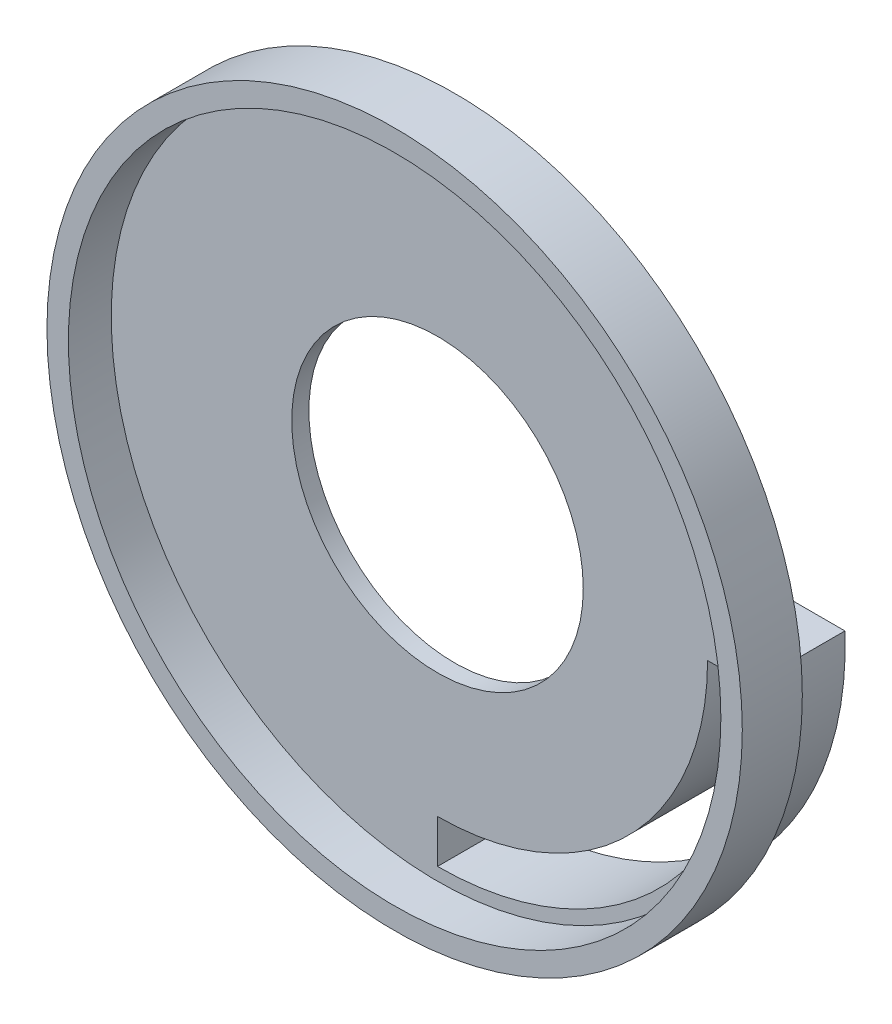
ISO-10303-21;
HEADER;
FILE_DESCRIPTION(('STEP AP214'),'2;1');
FILE_NAME('part.step','',(''),(''),'','','');
FILE_SCHEMA(('AUTOMOTIVE_DESIGN { 1 0 10303 214 1 1 1 1 }'));
ENDSEC;
DATA;
#1=APPLICATION_CONTEXT('core data for automotive mechanical design processes');
#2=APPLICATION_PROTOCOL_DEFINITION('international standard','automotive_design',2000,#1);
#3=PRODUCT_CONTEXT('',#1,'mechanical');
#4=PRODUCT('Part','Part','',(#3));
#5=PRODUCT_RELATED_PRODUCT_CATEGORY('part','',(#4));
#6=PRODUCT_DEFINITION_FORMATION('','',#4);
#7=PRODUCT_DEFINITION_CONTEXT('part definition',#1,'design');
#8=PRODUCT_DEFINITION('design','',#6,#7);
#9=PRODUCT_DEFINITION_SHAPE('','',#8);
#10=(LENGTH_UNIT() NAMED_UNIT(*) SI_UNIT(.MILLI.,.METRE.));
#11=(NAMED_UNIT(*) PLANE_ANGLE_UNIT() SI_UNIT($,.RADIAN.));
#12=(NAMED_UNIT(*) SI_UNIT($,.STERADIAN.) SOLID_ANGLE_UNIT());
#13=UNCERTAINTY_MEASURE_WITH_UNIT(LENGTH_MEASURE(1.E-05),#10,'distance_accuracy_value','');
#14=(GEOMETRIC_REPRESENTATION_CONTEXT(3) GLOBAL_UNCERTAINTY_ASSIGNED_CONTEXT((#13)) GLOBAL_UNIT_ASSIGNED_CONTEXT((#10,
#11,#12)) REPRESENTATION_CONTEXT('',''));
#15=CARTESIAN_POINT('',(0.,0.,0.));
#16=DIRECTION('',(0.,0.,1.));
#17=DIRECTION('',(1.,0.,0.));
#18=AXIS2_PLACEMENT_3D('',#15,#16,#17);
#19=CARTESIAN_POINT('',(0.,0.,0.));
#20=DIRECTION('',(0.,0.,1.));
#21=DIRECTION('',(1.,0.,0.));
#22=AXIS2_PLACEMENT_3D('',#19,#20,#21);
#23=PLANE('',#22);
#24=CARTESIAN_POINT('',(0.,0.,0.));
#25=DIRECTION('',(0.,0.,1.));
#26=DIRECTION('',(1.,0.,0.));
#27=AXIS2_PLACEMENT_3D('',#24,#25,#26);
#28=CIRCLE('',#27,34.);
#29=CARTESIAN_POINT('',(34.,0.,0.));
#30=VERTEX_POINT('',#29);
#31=EDGE_CURVE('E49',#30,#30,#28,.T.);
#32=ORIENTED_EDGE('',*,*,#31,.T.);
#33=EDGE_LOOP('',(#32));
#34=FACE_BOUND('',#33,.T.);
#35=CARTESIAN_POINT('',(0.,0.,0.));
#36=DIRECTION('',(0.,0.,1.));
#37=DIRECTION('',(1.,0.,0.));
#38=AXIS2_PLACEMENT_3D('',#35,#36,#37);
#39=CIRCLE('',#38,81.1);
#40=CARTESIAN_POINT('',(81.1,0.,0.));
#41=VERTEX_POINT('',#40);
#42=EDGE_CURVE('E185',#41,#41,#39,.T.);
#43=ORIENTED_EDGE('',*,*,#42,.F.);
#44=EDGE_LOOP('',(#43));
#45=FACE_BOUND('',#44,.T.);
#46=CARTESIAN_POINT('',(0.,0.,0.));
#47=DIRECTION('',(0.,0.,1.));
#48=DIRECTION('',(-1.,0.,0.));
#49=AXIS2_PLACEMENT_3D('',#46,#47,#48);
#50=CIRCLE('',#49,60.);
#51=CARTESIAN_POINT('',(-2.99999999999999,-59.9249530663145,0.));
#52=VERTEX_POINT('',#51);
#53=CARTESIAN_POINT('',(59.9249530663145,3.,0.));
#54=VERTEX_POINT('',#53);
#55=EDGE_CURVE('E138',#52,#54,#50,.T.);
#56=ORIENTED_EDGE('',*,*,#55,.F.);
#57=DIRECTION('',(0.,1.,0.));
#58=VECTOR('',#57,1.);
#59=CARTESIAN_POINT('',(-2.99999999999999,-59.9249530663145,0.));
#60=LINE('',#59,#58);
#61=CARTESIAN_POINT('',(-2.99999999999999,-76.0408442877905,0.));
#62=VERTEX_POINT('',#61);
#63=EDGE_CURVE('E143',#62,#52,#60,.T.);
#64=ORIENTED_EDGE('',*,*,#63,.F.);
#65=CARTESIAN_POINT('',(0.,0.,0.));
#66=DIRECTION('',(0.,0.,-1.));
#67=DIRECTION('',(-1.,0.,0.));
#68=AXIS2_PLACEMENT_3D('',#65,#66,#67);
#69=CIRCLE('',#68,76.1);
#70=CARTESIAN_POINT('',(76.0408442877905,3.,0.));
#71=VERTEX_POINT('',#70);
#72=EDGE_CURVE('E65',#71,#62,#69,.T.);
#73=ORIENTED_EDGE('',*,*,#72,.F.);
#74=DIRECTION('',(1.,0.,0.));
#75=VECTOR('',#74,1.);
#76=CARTESIAN_POINT('',(59.9249530663145,3.,0.));
#77=LINE('',#76,#75);
#78=EDGE_CURVE('E60',#54,#71,#77,.T.);
#79=ORIENTED_EDGE('',*,*,#78,.F.);
#80=EDGE_LOOP('',(#56,#64,#73,#79));
#81=FACE_BOUND('',#80,.T.);
#82=ADVANCED_FACE('F46',(#34,#45,#81),#23,.F.);
#83=CARTESIAN_POINT('',(0.,0.,4.));
#84=DIRECTION('',(0.,0.,1.));
#85=DIRECTION('',(1.,0.,0.));
#86=AXIS2_PLACEMENT_3D('',#83,#84,#85);
#87=PLANE('',#86);
#88=CARTESIAN_POINT('',(0.,0.,4.));
#89=DIRECTION('',(0.,0.,1.));
#90=DIRECTION('',(1.,0.,0.));
#91=AXIS2_PLACEMENT_3D('',#88,#89,#90);
#92=CIRCLE('',#91,76.1);
#93=CARTESIAN_POINT('',(76.1,0.,4.));
#94=VERTEX_POINT('',#93);
#95=EDGE_CURVE('E188',#94,#94,#92,.T.);
#96=ORIENTED_EDGE('',*,*,#95,.T.);
#97=EDGE_LOOP('',(#96));
#98=FACE_BOUND('',#97,.T.);
#99=CARTESIAN_POINT('',(0.,0.,4.));
#100=DIRECTION('',(0.,0.,1.));
#101=DIRECTION('',(1.,0.,0.));
#102=AXIS2_PLACEMENT_3D('',#99,#100,#101);
#103=CIRCLE('',#102,34.);
#104=CARTESIAN_POINT('',(34.,0.,4.));
#105=VERTEX_POINT('',#104);
#106=EDGE_CURVE('E12',#105,#105,#103,.T.);
#107=ORIENTED_EDGE('',*,*,#106,.F.);
#108=EDGE_LOOP('',(#107));
#109=FACE_BOUND('',#108,.T.);
#110=DIRECTION('',(1.,0.,0.));
#111=VECTOR('',#110,1.);
#112=CARTESIAN_POINT('',(0.,0.,4.));
#113=LINE('',#112,#111);
#114=CARTESIAN_POINT('',(63.,0.,4.));
#115=VERTEX_POINT('',#114);
#116=CARTESIAN_POINT('',(73.1,0.,4.));
#117=VERTEX_POINT('',#116);
#118=EDGE_CURVE('E116',#115,#117,#113,.T.);
#119=ORIENTED_EDGE('',*,*,#118,.T.);
#120=CARTESIAN_POINT('',(0.,0.,4.));
#121=DIRECTION('',(0.,0.,1.));
#122=DIRECTION('',(1.,0.,0.));
#123=AXIS2_PLACEMENT_3D('',#120,#121,#122);
#124=CIRCLE('',#123,73.1);
#125=CARTESIAN_POINT('',(0.,-73.1,4.));
#126=VERTEX_POINT('',#125);
#127=EDGE_CURVE('E166',#117,#126,#124,.F.);
#128=ORIENTED_EDGE('',*,*,#127,.T.);
#129=DIRECTION('',(0.,-1.,0.));
#130=VECTOR('',#129,1.);
#131=CARTESIAN_POINT('',(0.,0.,4.));
#132=LINE('',#131,#130);
#133=CARTESIAN_POINT('',(0.,-63.,4.));
#134=VERTEX_POINT('',#133);
#135=EDGE_CURVE('E172',#134,#126,#132,.T.);
#136=ORIENTED_EDGE('',*,*,#135,.F.);
#137=CARTESIAN_POINT('',(0.,0.,4.));
#138=DIRECTION('',(0.,0.,1.));
#139=DIRECTION('',(1.,0.,0.));
#140=AXIS2_PLACEMENT_3D('',#137,#138,#139);
#141=CIRCLE('',#140,63.);
#142=EDGE_CURVE('E170',#115,#134,#141,.F.);
#143=ORIENTED_EDGE('',*,*,#142,.F.);
#144=EDGE_LOOP('',(#119,#128,#136,#143));
#145=FACE_BOUND('',#144,.T.);
#146=ADVANCED_FACE('F200',(#98,#109,#145),#87,.T.);
#147=CARTESIAN_POINT('',(0.,0.,4.));
#148=DIRECTION('',(0.,0.,-1.));
#149=DIRECTION('',(-1.,0.,0.));
#150=AXIS2_PLACEMENT_3D('',#147,#148,#149);
#151=CYLINDRICAL_SURFACE('',#150,34.);
#152=ORIENTED_EDGE('',*,*,#106,.T.);
#153=EDGE_LOOP('',(#152));
#154=FACE_BOUND('',#153,.T.);
#155=ORIENTED_EDGE('',*,*,#31,.F.);
#156=EDGE_LOOP('',(#155));
#157=FACE_BOUND('',#156,.T.);
#158=ADVANCED_FACE('F197',(#154,#157),#151,.F.);
#159=CARTESIAN_POINT('',(0.,0.,0.));
#160=DIRECTION('',(0.,0.,1.));
#161=DIRECTION('',(1.,0.,0.));
#162=AXIS2_PLACEMENT_3D('',#159,#160,#161);
#163=CYLINDRICAL_SURFACE('',#162,76.1);
#164=ORIENTED_EDGE('',*,*,#95,.F.);
#165=EDGE_LOOP('',(#164));
#166=FACE_BOUND('',#165,.T.);
#167=CARTESIAN_POINT('',(0.,0.,14.));
#168=DIRECTION('',(0.,0.,1.));
#169=DIRECTION('',(1.,0.,0.));
#170=AXIS2_PLACEMENT_3D('',#167,#168,#169);
#171=CIRCLE('',#170,76.1);
#172=CARTESIAN_POINT('',(76.1,0.,14.));
#173=VERTEX_POINT('',#172);
#174=EDGE_CURVE('E177',#173,#173,#171,.T.);
#175=ORIENTED_EDGE('',*,*,#174,.T.);
#176=EDGE_LOOP('',(#175));
#177=FACE_BOUND('',#176,.T.);
#178=ADVANCED_FACE('F199',(#166,#177),#163,.F.);
#179=CARTESIAN_POINT('',(0.,0.,0.));
#180=DIRECTION('',(0.,0.,1.));
#181=DIRECTION('',(1.,0.,0.));
#182=AXIS2_PLACEMENT_3D('',#179,#180,#181);
#183=CYLINDRICAL_SURFACE('',#182,81.1);
#184=ORIENTED_EDGE('',*,*,#42,.T.);
#185=EDGE_LOOP('',(#184));
#186=FACE_BOUND('',#185,.T.);
#187=CARTESIAN_POINT('',(0.,0.,14.));
#188=DIRECTION('',(0.,0.,1.));
#189=DIRECTION('',(1.,0.,0.));
#190=AXIS2_PLACEMENT_3D('',#187,#188,#189);
#191=CIRCLE('',#190,81.1);
#192=CARTESIAN_POINT('',(81.1,0.,14.));
#193=VERTEX_POINT('',#192);
#194=EDGE_CURVE('E182',#193,#193,#191,.T.);
#195=ORIENTED_EDGE('',*,*,#194,.F.);
#196=EDGE_LOOP('',(#195));
#197=FACE_BOUND('',#196,.T.);
#198=ADVANCED_FACE('F207',(#186,#197),#183,.T.);
#199=CARTESIAN_POINT('',(0.,0.,14.));
#200=DIRECTION('',(0.,0.,1.));
#201=DIRECTION('',(1.,0.,0.));
#202=AXIS2_PLACEMENT_3D('',#199,#200,#201);
#203=PLANE('',#202);
#204=ORIENTED_EDGE('',*,*,#174,.F.);
#205=EDGE_LOOP('',(#204));
#206=FACE_BOUND('',#205,.T.);
#207=ORIENTED_EDGE('',*,*,#194,.T.);
#208=EDGE_LOOP('',(#207));
#209=FACE_BOUND('',#208,.T.);
#210=ADVANCED_FACE('F225',(#206,#209),#203,.T.);
#211=CARTESIAN_POINT('',(0.,0.,-1.));
#212=DIRECTION('',(0.,0.,1.));
#213=DIRECTION('',(1.,0.,0.));
#214=AXIS2_PLACEMENT_3D('',#211,#212,#213);
#215=CYLINDRICAL_SURFACE('',#214,73.1);
#216=DIRECTION('',(0.,0.,1.));
#217=VECTOR('',#216,1.);
#218=CARTESIAN_POINT('',(73.1,0.,-1.));
#219=LINE('',#218,#217);
#220=CARTESIAN_POINT('',(73.1,0.,-15.));
#221=VERTEX_POINT('',#220);
#222=EDGE_CURVE('E121',#221,#117,#219,.T.);
#223=ORIENTED_EDGE('',*,*,#222,.F.);
#224=CARTESIAN_POINT('',(0.,0.,-15.));
#225=DIRECTION('',(0.,0.,-1.));
#226=DIRECTION('',(-1.,0.,0.));
#227=AXIS2_PLACEMENT_3D('',#224,#225,#226);
#228=CIRCLE('',#227,73.1);
#229=CARTESIAN_POINT('',(0.,-73.1,-15.));
#230=VERTEX_POINT('',#229);
#231=EDGE_CURVE('E132',#221,#230,#228,.T.);
#232=ORIENTED_EDGE('',*,*,#231,.T.);
#233=DIRECTION('',(0.,0.,1.));
#234=VECTOR('',#233,1.);
#235=CARTESIAN_POINT('',(0.,-73.1,-1.));
#236=LINE('',#235,#234);
#237=EDGE_CURVE('E175',#230,#126,#236,.T.);
#238=ORIENTED_EDGE('',*,*,#237,.T.);
#239=ORIENTED_EDGE('',*,*,#127,.F.);
#240=EDGE_LOOP('',(#223,#232,#238,#239));
#241=FACE_BOUND('',#240,.T.);
#242=ADVANCED_FACE('F229',(#241),#215,.F.);
#243=CARTESIAN_POINT('',(0.,0.,-1.));
#244=DIRECTION('',(-1.,0.,0.));
#245=DIRECTION('',(0.,-1.,0.));
#246=AXIS2_PLACEMENT_3D('',#243,#244,#245);
#247=PLANE('',#246);
#248=DIRECTION('',(0.,0.,1.));
#249=VECTOR('',#248,1.);
#250=CARTESIAN_POINT('',(0.,-63.,-1.));
#251=LINE('',#250,#249);
#252=CARTESIAN_POINT('',(0.,-63.,-15.));
#253=VERTEX_POINT('',#252);
#254=EDGE_CURVE('E120',#253,#134,#251,.T.);
#255=ORIENTED_EDGE('',*,*,#254,.T.);
#256=ORIENTED_EDGE('',*,*,#135,.T.);
#257=ORIENTED_EDGE('',*,*,#237,.F.);
#258=DIRECTION('',(0.,1.,0.));
#259=VECTOR('',#258,1.);
#260=CARTESIAN_POINT('',(0.,-63.,-15.));
#261=LINE('',#260,#259);
#262=EDGE_CURVE('E134',#230,#253,#261,.T.);
#263=ORIENTED_EDGE('',*,*,#262,.T.);
#264=EDGE_LOOP('',(#255,#256,#257,#263));
#265=FACE_BOUND('',#264,.T.);
#266=ADVANCED_FACE('F260',(#265),#247,.F.);
#267=CARTESIAN_POINT('',(0.,0.,-1.));
#268=DIRECTION('',(0.,0.,1.));
#269=DIRECTION('',(1.,0.,0.));
#270=AXIS2_PLACEMENT_3D('',#267,#268,#269);
#271=CYLINDRICAL_SURFACE('',#270,63.);
#272=DIRECTION('',(0.,0.,1.));
#273=VECTOR('',#272,1.);
#274=CARTESIAN_POINT('',(63.,0.,-1.));
#275=LINE('',#274,#273);
#276=CARTESIAN_POINT('',(63.,0.,-15.));
#277=VERTEX_POINT('',#276);
#278=EDGE_CURVE('E108',#277,#115,#275,.T.);
#279=ORIENTED_EDGE('',*,*,#278,.T.);
#280=ORIENTED_EDGE('',*,*,#142,.T.);
#281=ORIENTED_EDGE('',*,*,#254,.F.);
#282=CARTESIAN_POINT('',(0.,0.,-15.));
#283=DIRECTION('',(0.,0.,1.));
#284=DIRECTION('',(-1.,0.,0.));
#285=AXIS2_PLACEMENT_3D('',#282,#283,#284);
#286=CIRCLE('',#285,63.);
#287=EDGE_CURVE('E124',#253,#277,#286,.T.);
#288=ORIENTED_EDGE('',*,*,#287,.T.);
#289=EDGE_LOOP('',(#279,#280,#281,#288));
#290=FACE_BOUND('',#289,.T.);
#291=ADVANCED_FACE('F125',(#290),#271,.T.);
#292=CARTESIAN_POINT('',(0.,0.,-1.));
#293=DIRECTION('',(0.,-1.,0.));
#294=DIRECTION('',(0.,0.,-1.));
#295=AXIS2_PLACEMENT_3D('',#292,#293,#294);
#296=PLANE('',#295);
#297=ORIENTED_EDGE('',*,*,#278,.F.);
#298=DIRECTION('',(1.,0.,0.));
#299=VECTOR('',#298,1.);
#300=CARTESIAN_POINT('',(63.,0.,-15.));
#301=LINE('',#300,#299);
#302=EDGE_CURVE('E113',#277,#221,#301,.T.);
#303=ORIENTED_EDGE('',*,*,#302,.T.);
#304=ORIENTED_EDGE('',*,*,#222,.T.);
#305=ORIENTED_EDGE('',*,*,#118,.F.);
#306=EDGE_LOOP('',(#297,#303,#304,#305));
#307=FACE_BOUND('',#306,.T.);
#308=ADVANCED_FACE('F110',(#307),#296,.T.);
#309=CARTESIAN_POINT('',(0.,0.,-15.));
#310=DIRECTION('',(0.,0.,-1.));
#311=DIRECTION('',(-1.,0.,0.));
#312=AXIS2_PLACEMENT_3D('',#309,#310,#311);
#313=PLANE('',#312);
#314=CARTESIAN_POINT('',(0.,0.,-15.));
#315=DIRECTION('',(0.,0.,1.));
#316=DIRECTION('',(-1.,0.,0.));
#317=AXIS2_PLACEMENT_3D('',#314,#315,#316);
#318=CIRCLE('',#317,60.);
#319=CARTESIAN_POINT('',(-2.99999999999999,-59.9249530663145,-15.));
#320=VERTEX_POINT('',#319);
#321=CARTESIAN_POINT('',(59.9249530663145,3.,-15.));
#322=VERTEX_POINT('',#321);
#323=EDGE_CURVE('E139',#320,#322,#318,.T.);
#324=ORIENTED_EDGE('',*,*,#323,.T.);
#325=DIRECTION('',(1.,0.,0.));
#326=VECTOR('',#325,1.);
#327=CARTESIAN_POINT('',(59.9249530663145,3.,-15.));
#328=LINE('',#327,#326);
#329=CARTESIAN_POINT('',(76.0408442877905,3.,-15.));
#330=VERTEX_POINT('',#329);
#331=EDGE_CURVE('E142',#322,#330,#328,.T.);
#332=ORIENTED_EDGE('',*,*,#331,.T.);
#333=CARTESIAN_POINT('',(0.,0.,-15.));
#334=DIRECTION('',(0.,0.,-1.));
#335=DIRECTION('',(-1.,0.,0.));
#336=AXIS2_PLACEMENT_3D('',#333,#334,#335);
#337=CIRCLE('',#336,76.1);
#338=CARTESIAN_POINT('',(-2.99999999999996,-76.0408442877905,-15.));
#339=VERTEX_POINT('',#338);
#340=EDGE_CURVE('E145',#330,#339,#337,.T.);
#341=ORIENTED_EDGE('',*,*,#340,.T.);
#342=DIRECTION('',(0.,1.,0.));
#343=VECTOR('',#342,1.);
#344=CARTESIAN_POINT('',(-2.99999999999999,-59.9249530663145,-15.));
#345=LINE('',#344,#343);
#346=EDGE_CURVE('E147',#339,#320,#345,.T.);
#347=ORIENTED_EDGE('',*,*,#346,.T.);
#348=EDGE_LOOP('',(#324,#332,#341,#347));
#349=FACE_BOUND('',#348,.T.);
#350=ORIENTED_EDGE('',*,*,#302,.F.);
#351=ORIENTED_EDGE('',*,*,#287,.F.);
#352=ORIENTED_EDGE('',*,*,#262,.F.);
#353=ORIENTED_EDGE('',*,*,#231,.F.);
#354=EDGE_LOOP('',(#350,#351,#352,#353));
#355=FACE_BOUND('',#354,.T.);
#356=ADVANCED_FACE('F130',(#349,#355),#313,.T.);
#357=CARTESIAN_POINT('',(0.,0.,-15.));
#358=DIRECTION('',(0.,0.,1.));
#359=DIRECTION('',(1.,0.,0.));
#360=AXIS2_PLACEMENT_3D('',#357,#358,#359);
#361=CYLINDRICAL_SURFACE('',#360,60.);
#362=ORIENTED_EDGE('',*,*,#55,.T.);
#363=DIRECTION('',(0.,0.,1.));
#364=VECTOR('',#363,1.);
#365=CARTESIAN_POINT('',(59.9249530663145,3.,-15.));
#366=LINE('',#365,#364);
#367=EDGE_CURVE('E164',#322,#54,#366,.T.);
#368=ORIENTED_EDGE('',*,*,#367,.F.);
#369=ORIENTED_EDGE('',*,*,#323,.F.);
#370=DIRECTION('',(0.,0.,1.));
#371=VECTOR('',#370,1.);
#372=CARTESIAN_POINT('',(-2.99999999999999,-59.9249530663145,-15.));
#373=LINE('',#372,#371);
#374=EDGE_CURVE('E149',#320,#52,#373,.T.);
#375=ORIENTED_EDGE('',*,*,#374,.T.);
#376=EDGE_LOOP('',(#362,#368,#369,#375));
#377=FACE_BOUND('',#376,.T.);
#378=ADVANCED_FACE('F269',(#377),#361,.F.);
#379=CARTESIAN_POINT('',(59.9249530663145,3.,-15.));
#380=DIRECTION('',(0.,-1.,0.));
#381=DIRECTION('',(0.,0.,-1.));
#382=AXIS2_PLACEMENT_3D('',#379,#380,#381);
#383=PLANE('',#382);
#384=ORIENTED_EDGE('',*,*,#78,.T.);
#385=DIRECTION('',(0.,0.,1.));
#386=VECTOR('',#385,1.);
#387=CARTESIAN_POINT('',(76.0408442877905,3.,-15.));
#388=LINE('',#387,#386);
#389=EDGE_CURVE('E161',#330,#71,#388,.T.);
#390=ORIENTED_EDGE('',*,*,#389,.F.);
#391=ORIENTED_EDGE('',*,*,#331,.F.);
#392=ORIENTED_EDGE('',*,*,#367,.T.);
#393=EDGE_LOOP('',(#384,#390,#391,#392));
#394=FACE_BOUND('',#393,.T.);
#395=ADVANCED_FACE('F272',(#394),#383,.F.);
#396=CARTESIAN_POINT('',(0.,0.,-15.));
#397=DIRECTION('',(0.,0.,1.));
#398=DIRECTION('',(1.,0.,0.));
#399=AXIS2_PLACEMENT_3D('',#396,#397,#398);
#400=CYLINDRICAL_SURFACE('',#399,76.1);
#401=ORIENTED_EDGE('',*,*,#72,.T.);
#402=DIRECTION('',(0.,0.,1.));
#403=VECTOR('',#402,1.);
#404=CARTESIAN_POINT('',(-2.99999999999996,-76.0408442877905,-15.));
#405=LINE('',#404,#403);
#406=EDGE_CURVE('E158',#339,#62,#405,.T.);
#407=ORIENTED_EDGE('',*,*,#406,.F.);
#408=ORIENTED_EDGE('',*,*,#340,.F.);
#409=ORIENTED_EDGE('',*,*,#389,.T.);
#410=EDGE_LOOP('',(#401,#407,#408,#409));
#411=FACE_BOUND('',#410,.T.);
#412=ADVANCED_FACE('F276',(#411),#400,.T.);
#413=CARTESIAN_POINT('',(-2.99999999999999,-59.9249530663145,-15.));
#414=DIRECTION('',(1.,0.,0.));
#415=DIRECTION('',(0.,0.,-1.));
#416=AXIS2_PLACEMENT_3D('',#413,#414,#415);
#417=PLANE('',#416);
#418=ORIENTED_EDGE('',*,*,#63,.T.);
#419=ORIENTED_EDGE('',*,*,#374,.F.);
#420=ORIENTED_EDGE('',*,*,#346,.F.);
#421=ORIENTED_EDGE('',*,*,#406,.T.);
#422=EDGE_LOOP('',(#418,#419,#420,#421));
#423=FACE_BOUND('',#422,.T.);
#424=ADVANCED_FACE('F280',(#423),#417,.F.);
#425=CLOSED_SHELL('',(#82,#146,#158,#178,#198,#210,#242,#266,#291,#308,#356,#378,#395,#412,#424));
#426=MANIFOLD_SOLID_BREP('B2',#425);
#427=ADVANCED_BREP_SHAPE_REPRESENTATION('',(#18,#426),#14);
#428=SHAPE_DEFINITION_REPRESENTATION(#9,#427);
ENDSEC;
END-ISO-10303-21;
